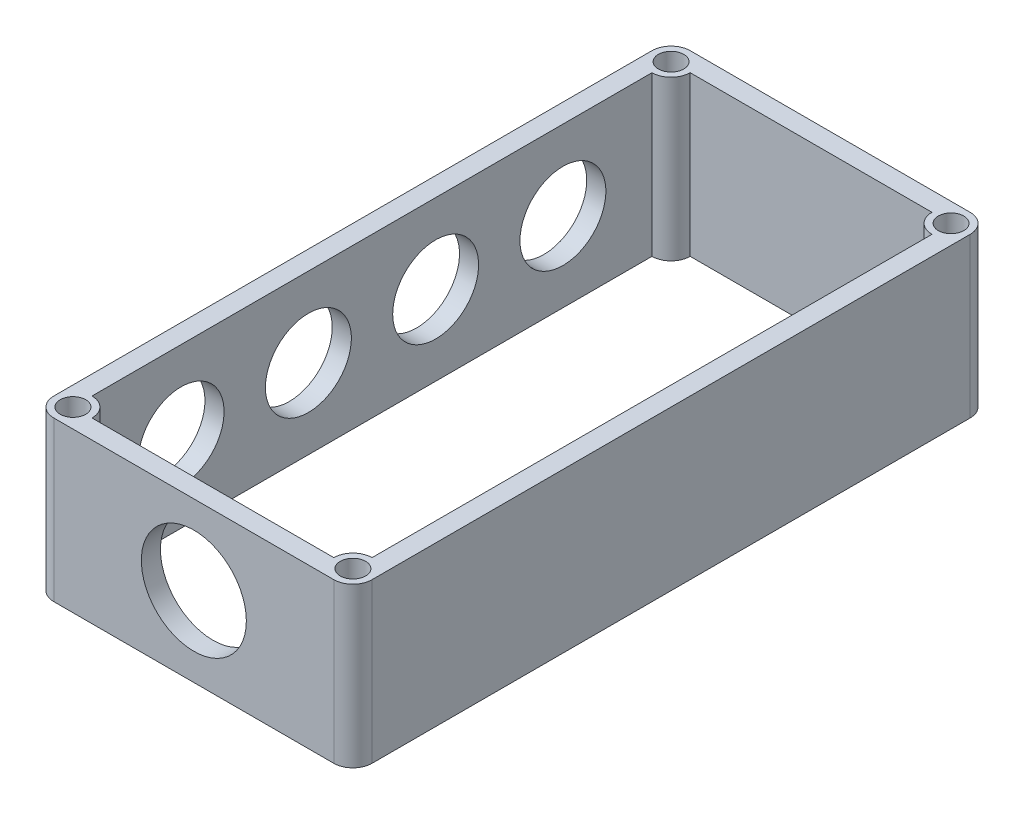
ISO-10303-21;
HEADER;
FILE_DESCRIPTION(('STEP AP214'),'2;1');
FILE_NAME('part.step','',(''),(''),'','','');
FILE_SCHEMA(('AUTOMOTIVE_DESIGN { 1 0 10303 214 1 1 1 1 }'));
ENDSEC;
DATA;
#1=APPLICATION_CONTEXT('core data for automotive mechanical design processes');
#2=APPLICATION_PROTOCOL_DEFINITION('international standard','automotive_design',2000,#1);
#3=PRODUCT_CONTEXT('',#1,'mechanical');
#4=PRODUCT('Part','Part','',(#3));
#5=PRODUCT_RELATED_PRODUCT_CATEGORY('part','',(#4));
#6=PRODUCT_DEFINITION_FORMATION('','',#4);
#7=PRODUCT_DEFINITION_CONTEXT('part definition',#1,'design');
#8=PRODUCT_DEFINITION('design','',#6,#7);
#9=PRODUCT_DEFINITION_SHAPE('','',#8);
#10=(LENGTH_UNIT() NAMED_UNIT(*) SI_UNIT(.MILLI.,.METRE.));
#11=(NAMED_UNIT(*) PLANE_ANGLE_UNIT() SI_UNIT($,.RADIAN.));
#12=(NAMED_UNIT(*) SI_UNIT($,.STERADIAN.) SOLID_ANGLE_UNIT());
#13=UNCERTAINTY_MEASURE_WITH_UNIT(LENGTH_MEASURE(1.E-05),#10,'distance_accuracy_value','');
#14=(GEOMETRIC_REPRESENTATION_CONTEXT(3) GLOBAL_UNCERTAINTY_ASSIGNED_CONTEXT((#13)) GLOBAL_UNIT_ASSIGNED_CONTEXT((#10,
#11,#12)) REPRESENTATION_CONTEXT('',''));
#15=CARTESIAN_POINT('',(0.,0.,0.));
#16=DIRECTION('',(0.,0.,1.));
#17=DIRECTION('',(1.,0.,0.));
#18=AXIS2_PLACEMENT_3D('',#15,#16,#17);
#19=CARTESIAN_POINT('',(22.,25.,0.));
#20=DIRECTION('',(-1.,0.,0.));
#21=DIRECTION('',(0.,0.,1.));
#22=AXIS2_PLACEMENT_3D('',#19,#20,#21);
#23=PLANE('',#22);
#24=DIRECTION('',(0.,0.,-1.));
#25=VECTOR('',#24,1.);
#26=CARTESIAN_POINT('',(22.,0.,0.));
#27=LINE('',#26,#25);
#28=CARTESIAN_POINT('',(22.,0.,44.));
#29=VERTEX_POINT('',#28);
#30=CARTESIAN_POINT('',(22.,0.,-44.));
#31=VERTEX_POINT('',#30);
#32=EDGE_CURVE('E249',#29,#31,#27,.T.);
#33=ORIENTED_EDGE('',*,*,#32,.F.);
#34=DIRECTION('',(0.,-1.,0.));
#35=VECTOR('',#34,1.);
#36=CARTESIAN_POINT('',(22.,25.,44.));
#37=LINE('',#36,#35);
#38=CARTESIAN_POINT('',(22.,25.,44.));
#39=VERTEX_POINT('',#38);
#40=EDGE_CURVE('E11',#39,#29,#37,.T.);
#41=ORIENTED_EDGE('',*,*,#40,.F.);
#42=DIRECTION('',(0.,0.,-1.));
#43=VECTOR('',#42,1.);
#44=CARTESIAN_POINT('',(22.,25.,0.));
#45=LINE('',#44,#43);
#46=CARTESIAN_POINT('',(22.,25.,-44.));
#47=VERTEX_POINT('',#46);
#48=EDGE_CURVE('E293',#39,#47,#45,.T.);
#49=ORIENTED_EDGE('',*,*,#48,.T.);
#50=DIRECTION('',(0.,-1.,0.));
#51=VECTOR('',#50,1.);
#52=CARTESIAN_POINT('',(22.,25.,-44.));
#53=LINE('',#52,#51);
#54=EDGE_CURVE('E118',#47,#31,#53,.T.);
#55=ORIENTED_EDGE('',*,*,#54,.T.);
#56=EDGE_LOOP('',(#33,#41,#49,#55));
#57=FACE_BOUND('',#56,.T.);
#58=ADVANCED_FACE('F41',(#57),#23,.T.);
#59=CARTESIAN_POINT('',(22.,25.,47.));
#60=DIRECTION('',(0.,-1.,0.));
#61=DIRECTION('',(0.,0.,-1.));
#62=AXIS2_PLACEMENT_3D('',#59,#60,#61);
#63=CYLINDRICAL_SURFACE('',#62,3.);
#64=CARTESIAN_POINT('',(22.,0.,47.));
#65=DIRECTION('',(0.,1.,0.));
#66=DIRECTION('',(0.,0.,1.));
#67=AXIS2_PLACEMENT_3D('',#64,#65,#66);
#68=CIRCLE('',#67,3.);
#69=CARTESIAN_POINT('',(19.,0.,47.));
#70=VERTEX_POINT('',#69);
#71=EDGE_CURVE('E246',#29,#70,#68,.T.);
#72=ORIENTED_EDGE('',*,*,#71,.T.);
#73=DIRECTION('',(0.,-1.,0.));
#74=VECTOR('',#73,1.);
#75=CARTESIAN_POINT('',(19.,25.,47.));
#76=LINE('',#75,#74);
#77=CARTESIAN_POINT('',(19.,25.,47.));
#78=VERTEX_POINT('',#77);
#79=EDGE_CURVE('E51',#78,#70,#76,.T.);
#80=ORIENTED_EDGE('',*,*,#79,.F.);
#81=CARTESIAN_POINT('',(22.,25.,47.));
#82=DIRECTION('',(0.,1.,0.));
#83=DIRECTION('',(0.,0.,1.));
#84=AXIS2_PLACEMENT_3D('',#81,#82,#83);
#85=CIRCLE('',#84,3.);
#86=EDGE_CURVE('E291',#39,#78,#85,.T.);
#87=ORIENTED_EDGE('',*,*,#86,.F.);
#88=ORIENTED_EDGE('',*,*,#40,.T.);
#89=EDGE_LOOP('',(#72,#80,#87,#88));
#90=FACE_BOUND('',#89,.T.);
#91=ADVANCED_FACE('F369',(#90),#63,.T.);
#92=CARTESIAN_POINT('',(0.,25.,47.));
#93=DIRECTION('',(0.,0.,-1.));
#94=DIRECTION('',(-1.,0.,0.));
#95=AXIS2_PLACEMENT_3D('',#92,#93,#94);
#96=PLANE('',#95);
#97=CARTESIAN_POINT('',(-3.96810110022986E-12,12.5,47.));
#98=DIRECTION('',(0.,0.,-1.));
#99=DIRECTION('',(-1.,0.,0.));
#100=AXIS2_PLACEMENT_3D('',#97,#98,#99);
#101=CIRCLE('',#100,8.25);
#102=CARTESIAN_POINT('',(-8.25000000000397,12.5,47.));
#103=VERTEX_POINT('',#102);
#104=EDGE_CURVE('E314',#103,#103,#101,.F.);
#105=ORIENTED_EDGE('',*,*,#104,.T.);
#106=EDGE_LOOP('',(#105));
#107=FACE_BOUND('',#106,.T.);
#108=DIRECTION('',(1.,0.,0.));
#109=VECTOR('',#108,1.);
#110=CARTESIAN_POINT('',(0.,0.,47.));
#111=LINE('',#110,#109);
#112=CARTESIAN_POINT('',(-19.,0.,47.));
#113=VERTEX_POINT('',#112);
#114=EDGE_CURVE('E243',#113,#70,#111,.T.);
#115=ORIENTED_EDGE('',*,*,#114,.F.);
#116=DIRECTION('',(0.,-1.,0.));
#117=VECTOR('',#116,1.);
#118=CARTESIAN_POINT('',(-19.,25.,47.));
#119=LINE('',#118,#117);
#120=CARTESIAN_POINT('',(-19.,25.,47.));
#121=VERTEX_POINT('',#120);
#122=EDGE_CURVE('E196',#121,#113,#119,.T.);
#123=ORIENTED_EDGE('',*,*,#122,.F.);
#124=DIRECTION('',(1.,0.,0.));
#125=VECTOR('',#124,1.);
#126=CARTESIAN_POINT('',(0.,25.,47.));
#127=LINE('',#126,#125);
#128=EDGE_CURVE('E288',#121,#78,#127,.T.);
#129=ORIENTED_EDGE('',*,*,#128,.T.);
#130=ORIENTED_EDGE('',*,*,#79,.T.);
#131=EDGE_LOOP('',(#115,#123,#129,#130));
#132=FACE_BOUND('',#131,.T.);
#133=ADVANCED_FACE('F363',(#107,#132),#96,.T.);
#134=CARTESIAN_POINT('',(-22.,25.,47.));
#135=DIRECTION('',(0.,-1.,0.));
#136=DIRECTION('',(0.,0.,-1.));
#137=AXIS2_PLACEMENT_3D('',#134,#135,#136);
#138=CYLINDRICAL_SURFACE('',#137,3.);
#139=CARTESIAN_POINT('',(-22.,0.,47.));
#140=DIRECTION('',(0.,1.,0.));
#141=DIRECTION('',(0.,0.,1.));
#142=AXIS2_PLACEMENT_3D('',#139,#140,#141);
#143=CIRCLE('',#142,3.);
#144=CARTESIAN_POINT('',(-22.,0.,44.));
#145=VERTEX_POINT('',#144);
#146=EDGE_CURVE('E240',#113,#145,#143,.T.);
#147=ORIENTED_EDGE('',*,*,#146,.T.);
#148=DIRECTION('',(0.,-1.,0.));
#149=VECTOR('',#148,1.);
#150=CARTESIAN_POINT('',(-22.,25.,44.));
#151=LINE('',#150,#149);
#152=CARTESIAN_POINT('',(-22.,25.,44.));
#153=VERTEX_POINT('',#152);
#154=EDGE_CURVE('E189',#153,#145,#151,.T.);
#155=ORIENTED_EDGE('',*,*,#154,.F.);
#156=CARTESIAN_POINT('',(-22.,25.,47.));
#157=DIRECTION('',(0.,1.,0.));
#158=DIRECTION('',(0.,0.,1.));
#159=AXIS2_PLACEMENT_3D('',#156,#157,#158);
#160=CIRCLE('',#159,3.);
#161=EDGE_CURVE('E286',#121,#153,#160,.T.);
#162=ORIENTED_EDGE('',*,*,#161,.F.);
#163=ORIENTED_EDGE('',*,*,#122,.T.);
#164=EDGE_LOOP('',(#147,#155,#162,#163));
#165=FACE_BOUND('',#164,.T.);
#166=ADVANCED_FACE('F347',(#165),#138,.T.);
#167=CARTESIAN_POINT('',(-22.,25.,0.));
#168=DIRECTION('',(-1.,0.,0.));
#169=DIRECTION('',(0.,0.,1.));
#170=AXIS2_PLACEMENT_3D('',#167,#168,#169);
#171=PLANE('',#170);
#172=CARTESIAN_POINT('',(-22.,12.5,-30.));
#173=DIRECTION('',(-1.,0.,0.));
#174=DIRECTION('',(0.,0.,1.));
#175=AXIS2_PLACEMENT_3D('',#172,#173,#174);
#176=CIRCLE('',#175,6.75);
#177=CARTESIAN_POINT('',(-22.,12.5,-23.25));
#178=VERTEX_POINT('',#177);
#179=EDGE_CURVE('E317',#178,#178,#176,.F.);
#180=ORIENTED_EDGE('',*,*,#179,.F.);
#181=EDGE_LOOP('',(#180));
#182=FACE_BOUND('',#181,.T.);
#183=CARTESIAN_POINT('',(-22.,12.5,-10.));
#184=DIRECTION('',(-1.,0.,0.));
#185=DIRECTION('',(0.,0.,1.));
#186=AXIS2_PLACEMENT_3D('',#183,#184,#185);
#187=CIRCLE('',#186,6.75);
#188=CARTESIAN_POINT('',(-22.,12.5,-3.25));
#189=VERTEX_POINT('',#188);
#190=EDGE_CURVE('E330',#189,#189,#187,.F.);
#191=ORIENTED_EDGE('',*,*,#190,.F.);
#192=EDGE_LOOP('',(#191));
#193=FACE_BOUND('',#192,.T.);
#194=CARTESIAN_POINT('',(-22.,12.5,10.));
#195=DIRECTION('',(-1.,0.,0.));
#196=DIRECTION('',(0.,0.,1.));
#197=AXIS2_PLACEMENT_3D('',#194,#195,#196);
#198=CIRCLE('',#197,6.75);
#199=CARTESIAN_POINT('',(-22.,12.5,16.75));
#200=VERTEX_POINT('',#199);
#201=EDGE_CURVE('E324',#200,#200,#198,.F.);
#202=ORIENTED_EDGE('',*,*,#201,.F.);
#203=EDGE_LOOP('',(#202));
#204=FACE_BOUND('',#203,.T.);
#205=CARTESIAN_POINT('',(-22.,12.5,30.));
#206=DIRECTION('',(-1.,0.,0.));
#207=DIRECTION('',(0.,0.,1.));
#208=AXIS2_PLACEMENT_3D('',#205,#206,#207);
#209=CIRCLE('',#208,6.75);
#210=CARTESIAN_POINT('',(-22.,12.5,36.75));
#211=VERTEX_POINT('',#210);
#212=EDGE_CURVE('E318',#211,#211,#209,.F.);
#213=ORIENTED_EDGE('',*,*,#212,.F.);
#214=EDGE_LOOP('',(#213));
#215=FACE_BOUND('',#214,.T.);
#216=DIRECTION('',(0.,0.,-1.));
#217=VECTOR('',#216,1.);
#218=CARTESIAN_POINT('',(-22.,0.,0.));
#219=LINE('',#218,#217);
#220=CARTESIAN_POINT('',(-22.,0.,-44.));
#221=VERTEX_POINT('',#220);
#222=EDGE_CURVE('E237',#145,#221,#219,.T.);
#223=ORIENTED_EDGE('',*,*,#222,.T.);
#224=DIRECTION('',(0.,-1.,0.));
#225=VECTOR('',#224,1.);
#226=CARTESIAN_POINT('',(-22.,25.,-44.));
#227=LINE('',#226,#225);
#228=CARTESIAN_POINT('',(-22.,25.,-44.));
#229=VERTEX_POINT('',#228);
#230=EDGE_CURVE('E187',#229,#221,#227,.T.);
#231=ORIENTED_EDGE('',*,*,#230,.F.);
#232=DIRECTION('',(0.,0.,-1.));
#233=VECTOR('',#232,1.);
#234=CARTESIAN_POINT('',(-22.,25.,0.));
#235=LINE('',#234,#233);
#236=EDGE_CURVE('E180',#153,#229,#235,.T.);
#237=ORIENTED_EDGE('',*,*,#236,.F.);
#238=ORIENTED_EDGE('',*,*,#154,.T.);
#239=EDGE_LOOP('',(#223,#231,#237,#238));
#240=FACE_BOUND('',#239,.T.);
#241=ADVANCED_FACE('F344',(#182,#193,#204,#215,#240),#171,.F.);
#242=CARTESIAN_POINT('',(-22.,25.,-47.));
#243=DIRECTION('',(0.,-1.,0.));
#244=DIRECTION('',(0.,0.,-1.));
#245=AXIS2_PLACEMENT_3D('',#242,#243,#244);
#246=CYLINDRICAL_SURFACE('',#245,3.);
#247=CARTESIAN_POINT('',(-22.,0.,-47.));
#248=DIRECTION('',(0.,1.,0.));
#249=DIRECTION('',(0.,0.,1.));
#250=AXIS2_PLACEMENT_3D('',#247,#248,#249);
#251=CIRCLE('',#250,3.);
#252=CARTESIAN_POINT('',(-19.,0.,-47.));
#253=VERTEX_POINT('',#252);
#254=EDGE_CURVE('E186',#221,#253,#251,.T.);
#255=ORIENTED_EDGE('',*,*,#254,.T.);
#256=DIRECTION('',(0.,-1.,0.));
#257=VECTOR('',#256,1.);
#258=CARTESIAN_POINT('',(-19.,25.,-47.));
#259=LINE('',#258,#257);
#260=CARTESIAN_POINT('',(-19.,25.,-47.));
#261=VERTEX_POINT('',#260);
#262=EDGE_CURVE('E171',#261,#253,#259,.T.);
#263=ORIENTED_EDGE('',*,*,#262,.F.);
#264=CARTESIAN_POINT('',(-22.,25.,-47.));
#265=DIRECTION('',(0.,1.,0.));
#266=DIRECTION('',(0.,0.,1.));
#267=AXIS2_PLACEMENT_3D('',#264,#265,#266);
#268=CIRCLE('',#267,3.);
#269=EDGE_CURVE('E174',#229,#261,#268,.T.);
#270=ORIENTED_EDGE('',*,*,#269,.F.);
#271=ORIENTED_EDGE('',*,*,#230,.T.);
#272=EDGE_LOOP('',(#255,#263,#270,#271));
#273=FACE_BOUND('',#272,.T.);
#274=ADVANCED_FACE('F185',(#273),#246,.T.);
#275=CARTESIAN_POINT('',(0.,25.,-47.));
#276=DIRECTION('',(0.,0.,-1.));
#277=DIRECTION('',(-1.,0.,0.));
#278=AXIS2_PLACEMENT_3D('',#275,#276,#277);
#279=PLANE('',#278);
#280=DIRECTION('',(1.,0.,0.));
#281=VECTOR('',#280,1.);
#282=CARTESIAN_POINT('',(0.,0.,-47.));
#283=LINE('',#282,#281);
#284=CARTESIAN_POINT('',(19.,0.,-47.));
#285=VERTEX_POINT('',#284);
#286=EDGE_CURVE('E234',#253,#285,#283,.T.);
#287=ORIENTED_EDGE('',*,*,#286,.T.);
#288=DIRECTION('',(0.,-1.,0.));
#289=VECTOR('',#288,1.);
#290=CARTESIAN_POINT('',(19.,25.,-47.));
#291=LINE('',#290,#289);
#292=CARTESIAN_POINT('',(19.,25.,-47.));
#293=VERTEX_POINT('',#292);
#294=EDGE_CURVE('E173',#293,#285,#291,.T.);
#295=ORIENTED_EDGE('',*,*,#294,.F.);
#296=DIRECTION('',(1.,0.,0.));
#297=VECTOR('',#296,1.);
#298=CARTESIAN_POINT('',(0.,25.,-47.));
#299=LINE('',#298,#297);
#300=EDGE_CURVE('E166',#261,#293,#299,.T.);
#301=ORIENTED_EDGE('',*,*,#300,.F.);
#302=ORIENTED_EDGE('',*,*,#262,.T.);
#303=EDGE_LOOP('',(#287,#295,#301,#302));
#304=FACE_BOUND('',#303,.T.);
#305=ADVANCED_FACE('F169',(#304),#279,.F.);
#306=CARTESIAN_POINT('',(0.,25.,50.));
#307=DIRECTION('',(0.,0.,-1.));
#308=DIRECTION('',(-1.,0.,0.));
#309=AXIS2_PLACEMENT_3D('',#306,#307,#308);
#310=PLANE('',#309);
#311=CARTESIAN_POINT('',(-3.96810110022986E-12,12.5,50.));
#312=DIRECTION('',(0.,0.,1.));
#313=DIRECTION('',(1.,0.,0.));
#314=AXIS2_PLACEMENT_3D('',#311,#312,#313);
#315=CIRCLE('',#314,8.25);
#316=CARTESIAN_POINT('',(8.24999999999603,12.5,50.));
#317=VERTEX_POINT('',#316);
#318=EDGE_CURVE('E272',#317,#317,#315,.T.);
#319=ORIENTED_EDGE('',*,*,#318,.F.);
#320=EDGE_LOOP('',(#319));
#321=FACE_BOUND('',#320,.T.);
#322=DIRECTION('',(1.,0.,0.));
#323=VECTOR('',#322,1.);
#324=CARTESIAN_POINT('',(0.,0.,50.));
#325=LINE('',#324,#323);
#326=CARTESIAN_POINT('',(-22.,0.,50.));
#327=VERTEX_POINT('',#326);
#328=CARTESIAN_POINT('',(22.,0.,50.));
#329=VERTEX_POINT('',#328);
#330=EDGE_CURVE('E270',#327,#329,#325,.T.);
#331=ORIENTED_EDGE('',*,*,#330,.T.);
#332=DIRECTION('',(0.,-1.,0.));
#333=VECTOR('',#332,1.);
#334=CARTESIAN_POINT('',(22.,25.,50.));
#335=LINE('',#334,#333);
#336=CARTESIAN_POINT('',(22.,25.,50.));
#337=VERTEX_POINT('',#336);
#338=EDGE_CURVE('E45',#337,#329,#335,.T.);
#339=ORIENTED_EDGE('',*,*,#338,.F.);
#340=DIRECTION('',(1.,0.,0.));
#341=VECTOR('',#340,1.);
#342=CARTESIAN_POINT('',(0.,25.,50.));
#343=LINE('',#342,#341);
#344=CARTESIAN_POINT('',(-22.,25.,50.));
#345=VERTEX_POINT('',#344);
#346=EDGE_CURVE('E223',#345,#337,#343,.T.);
#347=ORIENTED_EDGE('',*,*,#346,.F.);
#348=DIRECTION('',(0.,-1.,0.));
#349=VECTOR('',#348,1.);
#350=CARTESIAN_POINT('',(-22.,25.,50.));
#351=LINE('',#350,#349);
#352=EDGE_CURVE('E199',#345,#327,#351,.T.);
#353=ORIENTED_EDGE('',*,*,#352,.T.);
#354=EDGE_LOOP('',(#331,#339,#347,#353));
#355=FACE_BOUND('',#354,.T.);
#356=ADVANCED_FACE('F43',(#321,#355),#310,.F.);
#357=CARTESIAN_POINT('',(22.,25.,47.));
#358=DIRECTION('',(0.,-1.,0.));
#359=DIRECTION('',(0.,0.,-1.));
#360=AXIS2_PLACEMENT_3D('',#357,#358,#359);
#361=CYLINDRICAL_SURFACE('',#360,3.00000000000001);
#362=CARTESIAN_POINT('',(22.,0.,47.));
#363=DIRECTION('',(0.,1.,0.));
#364=DIRECTION('',(0.,0.,1.));
#365=AXIS2_PLACEMENT_3D('',#362,#363,#364);
#366=CIRCLE('',#365,3.00000000000001);
#367=CARTESIAN_POINT('',(25.,0.,47.));
#368=VERTEX_POINT('',#367);
#369=EDGE_CURVE('E268',#329,#368,#366,.T.);
#370=ORIENTED_EDGE('',*,*,#369,.T.);
#371=DIRECTION('',(0.,-1.,0.));
#372=VECTOR('',#371,1.);
#373=CARTESIAN_POINT('',(25.,25.,47.));
#374=LINE('',#373,#372);
#375=CARTESIAN_POINT('',(25.,25.,47.));
#376=VERTEX_POINT('',#375);
#377=EDGE_CURVE('E212',#376,#368,#374,.T.);
#378=ORIENTED_EDGE('',*,*,#377,.F.);
#379=CARTESIAN_POINT('',(22.,25.,47.));
#380=DIRECTION('',(0.,1.,0.));
#381=DIRECTION('',(0.,0.,1.));
#382=AXIS2_PLACEMENT_3D('',#379,#380,#381);
#383=CIRCLE('',#382,3.00000000000001);
#384=EDGE_CURVE('E126',#337,#376,#383,.T.);
#385=ORIENTED_EDGE('',*,*,#384,.F.);
#386=ORIENTED_EDGE('',*,*,#338,.T.);
#387=EDGE_LOOP('',(#370,#378,#385,#386));
#388=FACE_BOUND('',#387,.T.);
#389=ADVANCED_FACE('F410',(#388),#361,.T.);
#390=CARTESIAN_POINT('',(25.,25.,0.));
#391=DIRECTION('',(-1.,0.,0.));
#392=DIRECTION('',(0.,0.,1.));
#393=AXIS2_PLACEMENT_3D('',#390,#391,#392);
#394=PLANE('',#393);
#395=DIRECTION('',(0.,0.,-1.));
#396=VECTOR('',#395,1.);
#397=CARTESIAN_POINT('',(25.,0.,0.));
#398=LINE('',#397,#396);
#399=CARTESIAN_POINT('',(25.,0.,-47.));
#400=VERTEX_POINT('',#399);
#401=EDGE_CURVE('E266',#368,#400,#398,.T.);
#402=ORIENTED_EDGE('',*,*,#401,.T.);
#403=DIRECTION('',(0.,-1.,0.));
#404=VECTOR('',#403,1.);
#405=CARTESIAN_POINT('',(25.,25.,-47.));
#406=LINE('',#405,#404);
#407=CARTESIAN_POINT('',(25.,25.,-47.));
#408=VERTEX_POINT('',#407);
#409=EDGE_CURVE('E210',#408,#400,#406,.T.);
#410=ORIENTED_EDGE('',*,*,#409,.F.);
#411=DIRECTION('',(0.,0.,-1.));
#412=VECTOR('',#411,1.);
#413=CARTESIAN_POINT('',(25.,25.,0.));
#414=LINE('',#413,#412);
#415=EDGE_CURVE('E308',#376,#408,#414,.T.);
#416=ORIENTED_EDGE('',*,*,#415,.F.);
#417=ORIENTED_EDGE('',*,*,#377,.T.);
#418=EDGE_LOOP('',(#402,#410,#416,#417));
#419=FACE_BOUND('',#418,.T.);
#420=ADVANCED_FACE('F407',(#419),#394,.F.);
#421=CARTESIAN_POINT('',(22.,25.,-47.));
#422=DIRECTION('',(0.,-1.,0.));
#423=DIRECTION('',(0.,0.,-1.));
#424=AXIS2_PLACEMENT_3D('',#421,#422,#423);
#425=CYLINDRICAL_SURFACE('',#424,3.);
#426=CARTESIAN_POINT('',(22.,0.,-47.));
#427=DIRECTION('',(0.,1.,0.));
#428=DIRECTION('',(0.,0.,1.));
#429=AXIS2_PLACEMENT_3D('',#426,#427,#428);
#430=CIRCLE('',#429,3.);
#431=CARTESIAN_POINT('',(22.,0.,-50.));
#432=VERTEX_POINT('',#431);
#433=EDGE_CURVE('E263',#400,#432,#430,.T.);
#434=ORIENTED_EDGE('',*,*,#433,.T.);
#435=DIRECTION('',(0.,-1.,0.));
#436=VECTOR('',#435,1.);
#437=CARTESIAN_POINT('',(22.,25.,-50.));
#438=LINE('',#437,#436);
#439=CARTESIAN_POINT('',(22.,25.,-50.));
#440=VERTEX_POINT('',#439);
#441=EDGE_CURVE('E208',#440,#432,#438,.T.);
#442=ORIENTED_EDGE('',*,*,#441,.F.);
#443=CARTESIAN_POINT('',(22.,25.,-47.));
#444=DIRECTION('',(0.,1.,0.));
#445=DIRECTION('',(0.,0.,1.));
#446=AXIS2_PLACEMENT_3D('',#443,#444,#445);
#447=CIRCLE('',#446,3.);
#448=EDGE_CURVE('E306',#408,#440,#447,.T.);
#449=ORIENTED_EDGE('',*,*,#448,.F.);
#450=ORIENTED_EDGE('',*,*,#409,.T.);
#451=EDGE_LOOP('',(#434,#442,#449,#450));
#452=FACE_BOUND('',#451,.T.);
#453=ADVANCED_FACE('F403',(#452),#425,.T.);
#454=CARTESIAN_POINT('',(0.,25.,-50.));
#455=DIRECTION('',(0.,0.,-1.));
#456=DIRECTION('',(-1.,0.,0.));
#457=AXIS2_PLACEMENT_3D('',#454,#455,#456);
#458=PLANE('',#457);
#459=DIRECTION('',(1.,0.,0.));
#460=VECTOR('',#459,1.);
#461=CARTESIAN_POINT('',(0.,0.,-50.));
#462=LINE('',#461,#460);
#463=CARTESIAN_POINT('',(-22.,0.,-50.));
#464=VERTEX_POINT('',#463);
#465=EDGE_CURVE('E260',#464,#432,#462,.T.);
#466=ORIENTED_EDGE('',*,*,#465,.F.);
#467=DIRECTION('',(0.,-1.,0.));
#468=VECTOR('',#467,1.);
#469=CARTESIAN_POINT('',(-22.,25.,-50.));
#470=LINE('',#469,#468);
#471=CARTESIAN_POINT('',(-22.,25.,-50.));
#472=VERTEX_POINT('',#471);
#473=EDGE_CURVE('E206',#472,#464,#470,.T.);
#474=ORIENTED_EDGE('',*,*,#473,.F.);
#475=DIRECTION('',(1.,0.,0.));
#476=VECTOR('',#475,1.);
#477=CARTESIAN_POINT('',(0.,25.,-50.));
#478=LINE('',#477,#476);
#479=EDGE_CURVE('E303',#472,#440,#478,.T.);
#480=ORIENTED_EDGE('',*,*,#479,.T.);
#481=ORIENTED_EDGE('',*,*,#441,.T.);
#482=EDGE_LOOP('',(#466,#474,#480,#481));
#483=FACE_BOUND('',#482,.T.);
#484=ADVANCED_FACE('F399',(#483),#458,.T.);
#485=CARTESIAN_POINT('',(-22.,25.,-47.));
#486=DIRECTION('',(0.,-1.,0.));
#487=DIRECTION('',(0.,0.,-1.));
#488=AXIS2_PLACEMENT_3D('',#485,#486,#487);
#489=CYLINDRICAL_SURFACE('',#488,3.);
#490=CARTESIAN_POINT('',(-22.,0.,-47.));
#491=DIRECTION('',(0.,1.,0.));
#492=DIRECTION('',(0.,0.,1.));
#493=AXIS2_PLACEMENT_3D('',#490,#491,#492);
#494=CIRCLE('',#493,3.);
#495=CARTESIAN_POINT('',(-25.,0.,-47.));
#496=VERTEX_POINT('',#495);
#497=EDGE_CURVE('E257',#464,#496,#494,.T.);
#498=ORIENTED_EDGE('',*,*,#497,.T.);
#499=DIRECTION('',(0.,-1.,0.));
#500=VECTOR('',#499,1.);
#501=CARTESIAN_POINT('',(-25.,25.,-47.));
#502=LINE('',#501,#500);
#503=CARTESIAN_POINT('',(-25.,25.,-47.));
#504=VERTEX_POINT('',#503);
#505=EDGE_CURVE('E204',#504,#496,#502,.T.);
#506=ORIENTED_EDGE('',*,*,#505,.F.);
#507=CARTESIAN_POINT('',(-22.,25.,-47.));
#508=DIRECTION('',(0.,1.,0.));
#509=DIRECTION('',(0.,0.,1.));
#510=AXIS2_PLACEMENT_3D('',#507,#508,#509);
#511=CIRCLE('',#510,3.);
#512=EDGE_CURVE('E301',#472,#504,#511,.T.);
#513=ORIENTED_EDGE('',*,*,#512,.F.);
#514=ORIENTED_EDGE('',*,*,#473,.T.);
#515=EDGE_LOOP('',(#498,#506,#513,#514));
#516=FACE_BOUND('',#515,.T.);
#517=ADVANCED_FACE('F395',(#516),#489,.T.);
#518=CARTESIAN_POINT('',(-25.,25.,0.));
#519=DIRECTION('',(-1.,0.,0.));
#520=DIRECTION('',(0.,0.,1.));
#521=AXIS2_PLACEMENT_3D('',#518,#519,#520);
#522=PLANE('',#521);
#523=CARTESIAN_POINT('',(-25.,12.5,-30.));
#524=DIRECTION('',(-1.,0.,0.));
#525=DIRECTION('',(0.,0.,1.));
#526=AXIS2_PLACEMENT_3D('',#523,#524,#525);
#527=CIRCLE('',#526,6.75);
#528=CARTESIAN_POINT('',(-25.,12.5,-23.25));
#529=VERTEX_POINT('',#528);
#530=EDGE_CURVE('E336',#529,#529,#527,.T.);
#531=ORIENTED_EDGE('',*,*,#530,.F.);
#532=EDGE_LOOP('',(#531));
#533=FACE_BOUND('',#532,.T.);
#534=CARTESIAN_POINT('',(-25.,12.5,-10.));
#535=DIRECTION('',(-1.,0.,0.));
#536=DIRECTION('',(0.,0.,1.));
#537=AXIS2_PLACEMENT_3D('',#534,#535,#536);
#538=CIRCLE('',#537,6.75);
#539=CARTESIAN_POINT('',(-25.,12.5,-3.25));
#540=VERTEX_POINT('',#539);
#541=EDGE_CURVE('E333',#540,#540,#538,.T.);
#542=ORIENTED_EDGE('',*,*,#541,.F.);
#543=EDGE_LOOP('',(#542));
#544=FACE_BOUND('',#543,.T.);
#545=CARTESIAN_POINT('',(-25.,12.5,10.));
#546=DIRECTION('',(-1.,0.,0.));
#547=DIRECTION('',(0.,0.,-1.));
#548=AXIS2_PLACEMENT_3D('',#545,#546,#547);
#549=CIRCLE('',#548,6.75);
#550=CARTESIAN_POINT('',(-25.,12.5,3.25));
#551=VERTEX_POINT('',#550);
#552=EDGE_CURVE('E327',#551,#551,#549,.T.);
#553=ORIENTED_EDGE('',*,*,#552,.F.);
#554=EDGE_LOOP('',(#553));
#555=FACE_BOUND('',#554,.T.);
#556=CARTESIAN_POINT('',(-25.,12.5,30.));
#557=DIRECTION('',(-1.,0.,0.));
#558=DIRECTION('',(0.,0.,-1.));
#559=AXIS2_PLACEMENT_3D('',#556,#557,#558);
#560=CIRCLE('',#559,6.75);
#561=CARTESIAN_POINT('',(-25.,12.5,23.25));
#562=VERTEX_POINT('',#561);
#563=EDGE_CURVE('E321',#562,#562,#560,.T.);
#564=ORIENTED_EDGE('',*,*,#563,.F.);
#565=EDGE_LOOP('',(#564));
#566=FACE_BOUND('',#565,.T.);
#567=DIRECTION('',(0.,0.,-1.));
#568=VECTOR('',#567,1.);
#569=CARTESIAN_POINT('',(-25.,0.,0.));
#570=LINE('',#569,#568);
#571=CARTESIAN_POINT('',(-25.,0.,47.));
#572=VERTEX_POINT('',#571);
#573=EDGE_CURVE('E254',#572,#496,#570,.T.);
#574=ORIENTED_EDGE('',*,*,#573,.F.);
#575=DIRECTION('',(0.,-1.,0.));
#576=VECTOR('',#575,1.);
#577=CARTESIAN_POINT('',(-25.,25.,47.));
#578=LINE('',#577,#576);
#579=CARTESIAN_POINT('',(-25.,25.,47.));
#580=VERTEX_POINT('',#579);
#581=EDGE_CURVE('E201',#580,#572,#578,.T.);
#582=ORIENTED_EDGE('',*,*,#581,.F.);
#583=DIRECTION('',(0.,0.,-1.));
#584=VECTOR('',#583,1.);
#585=CARTESIAN_POINT('',(-25.,25.,0.));
#586=LINE('',#585,#584);
#587=EDGE_CURVE('E298',#580,#504,#586,.T.);
#588=ORIENTED_EDGE('',*,*,#587,.T.);
#589=ORIENTED_EDGE('',*,*,#505,.T.);
#590=EDGE_LOOP('',(#574,#582,#588,#589));
#591=FACE_BOUND('',#590,.T.);
#592=ADVANCED_FACE('F391',(#533,#544,#555,#566,#591),#522,.T.);
#593=CARTESIAN_POINT('',(-22.,25.,47.));
#594=DIRECTION('',(0.,-1.,0.));
#595=DIRECTION('',(0.,0.,-1.));
#596=AXIS2_PLACEMENT_3D('',#593,#594,#595);
#597=CYLINDRICAL_SURFACE('',#596,2.00000000000001);
#598=CARTESIAN_POINT('',(-22.,25.,47.));
#599=DIRECTION('',(0.,1.,0.));
#600=DIRECTION('',(0.,0.,1.));
#601=AXIS2_PLACEMENT_3D('',#598,#599,#600);
#602=CIRCLE('',#601,2.00000000000001);
#603=CARTESIAN_POINT('',(-22.,25.,49.));
#604=VERTEX_POINT('',#603);
#605=EDGE_CURVE('E275',#604,#604,#602,.T.);
#606=ORIENTED_EDGE('',*,*,#605,.T.);
#607=EDGE_LOOP('',(#606));
#608=FACE_BOUND('',#607,.T.);
#609=CARTESIAN_POINT('',(-22.,0.,47.));
#610=DIRECTION('',(0.,1.,0.));
#611=DIRECTION('',(0.,0.,1.));
#612=AXIS2_PLACEMENT_3D('',#609,#610,#611);
#613=CIRCLE('',#612,2.00000000000001);
#614=CARTESIAN_POINT('',(-22.,0.,49.));
#615=VERTEX_POINT('',#614);
#616=EDGE_CURVE('E224',#615,#615,#613,.T.);
#617=ORIENTED_EDGE('',*,*,#616,.F.);
#618=EDGE_LOOP('',(#617));
#619=FACE_BOUND('',#618,.T.);
#620=ADVANCED_FACE('F394',(#608,#619),#597,.F.);
#621=CARTESIAN_POINT('',(22.,25.,-47.));
#622=DIRECTION('',(0.,-1.,0.));
#623=DIRECTION('',(0.,0.,-1.));
#624=AXIS2_PLACEMENT_3D('',#621,#622,#623);
#625=CYLINDRICAL_SURFACE('',#624,2.00000000000001);
#626=CARTESIAN_POINT('',(22.,25.,-47.));
#627=DIRECTION('',(0.,1.,0.));
#628=DIRECTION('',(0.,0.,1.));
#629=AXIS2_PLACEMENT_3D('',#626,#627,#628);
#630=CIRCLE('',#629,2.00000000000001);
#631=CARTESIAN_POINT('',(22.,25.,-45.));
#632=VERTEX_POINT('',#631);
#633=EDGE_CURVE('E278',#632,#632,#630,.T.);
#634=ORIENTED_EDGE('',*,*,#633,.T.);
#635=EDGE_LOOP('',(#634));
#636=FACE_BOUND('',#635,.T.);
#637=CARTESIAN_POINT('',(22.,0.,-47.));
#638=DIRECTION('',(0.,1.,0.));
#639=DIRECTION('',(0.,0.,1.));
#640=AXIS2_PLACEMENT_3D('',#637,#638,#639);
#641=CIRCLE('',#640,2.00000000000001);
#642=CARTESIAN_POINT('',(22.,0.,-45.));
#643=VERTEX_POINT('',#642);
#644=EDGE_CURVE('E227',#643,#643,#641,.T.);
#645=ORIENTED_EDGE('',*,*,#644,.F.);
#646=EDGE_LOOP('',(#645));
#647=FACE_BOUND('',#646,.T.);
#648=ADVANCED_FACE('F451',(#636,#647),#625,.F.);
#649=CARTESIAN_POINT('',(22.,25.,47.));
#650=DIRECTION('',(0.,-1.,0.));
#651=DIRECTION('',(0.,0.,-1.));
#652=AXIS2_PLACEMENT_3D('',#649,#650,#651);
#653=CYLINDRICAL_SURFACE('',#652,2.00000000000001);
#654=CARTESIAN_POINT('',(22.,25.,47.));
#655=DIRECTION('',(0.,1.,0.));
#656=DIRECTION('',(0.,0.,1.));
#657=AXIS2_PLACEMENT_3D('',#654,#655,#656);
#658=CIRCLE('',#657,2.00000000000001);
#659=CARTESIAN_POINT('',(22.,25.,49.));
#660=VERTEX_POINT('',#659);
#661=EDGE_CURVE('E281',#660,#660,#658,.T.);
#662=ORIENTED_EDGE('',*,*,#661,.T.);
#663=EDGE_LOOP('',(#662));
#664=FACE_BOUND('',#663,.T.);
#665=CARTESIAN_POINT('',(22.,0.,47.));
#666=DIRECTION('',(0.,1.,0.));
#667=DIRECTION('',(0.,0.,1.));
#668=AXIS2_PLACEMENT_3D('',#665,#666,#667);
#669=CIRCLE('',#668,2.00000000000001);
#670=CARTESIAN_POINT('',(22.,0.,49.));
#671=VERTEX_POINT('',#670);
#672=EDGE_CURVE('E230',#671,#671,#669,.T.);
#673=ORIENTED_EDGE('',*,*,#672,.F.);
#674=EDGE_LOOP('',(#673));
#675=FACE_BOUND('',#674,.T.);
#676=ADVANCED_FACE('F455',(#664,#675),#653,.F.);
#677=CARTESIAN_POINT('',(22.,25.,-47.));
#678=DIRECTION('',(0.,-1.,0.));
#679=DIRECTION('',(0.,0.,-1.));
#680=AXIS2_PLACEMENT_3D('',#677,#678,#679);
#681=CYLINDRICAL_SURFACE('',#680,3.);
#682=CARTESIAN_POINT('',(22.,0.,-47.));
#683=DIRECTION('',(0.,1.,0.));
#684=DIRECTION('',(0.,0.,1.));
#685=AXIS2_PLACEMENT_3D('',#682,#683,#684);
#686=CIRCLE('',#685,3.);
#687=EDGE_CURVE('E111',#285,#31,#686,.T.);
#688=ORIENTED_EDGE('',*,*,#687,.T.);
#689=ORIENTED_EDGE('',*,*,#54,.F.);
#690=CARTESIAN_POINT('',(22.,25.,-47.));
#691=DIRECTION('',(0.,1.,0.));
#692=DIRECTION('',(0.,0.,1.));
#693=AXIS2_PLACEMENT_3D('',#690,#691,#692);
#694=CIRCLE('',#693,3.);
#695=EDGE_CURVE('E60',#293,#47,#694,.T.);
#696=ORIENTED_EDGE('',*,*,#695,.F.);
#697=ORIENTED_EDGE('',*,*,#294,.T.);
#698=EDGE_LOOP('',(#688,#689,#696,#697));
#699=FACE_BOUND('',#698,.T.);
#700=ADVANCED_FACE('F389',(#699),#681,.T.);
#701=CARTESIAN_POINT('',(-22.,25.,47.));
#702=DIRECTION('',(0.,-1.,0.));
#703=DIRECTION('',(0.,0.,-1.));
#704=AXIS2_PLACEMENT_3D('',#701,#702,#703);
#705=CYLINDRICAL_SURFACE('',#704,3.00000000000001);
#706=CARTESIAN_POINT('',(-22.,0.,47.));
#707=DIRECTION('',(0.,1.,0.));
#708=DIRECTION('',(0.,0.,1.));
#709=AXIS2_PLACEMENT_3D('',#706,#707,#708);
#710=CIRCLE('',#709,3.00000000000001);
#711=EDGE_CURVE('E251',#327,#572,#710,.F.);
#712=ORIENTED_EDGE('',*,*,#711,.F.);
#713=ORIENTED_EDGE('',*,*,#352,.F.);
#714=CARTESIAN_POINT('',(-22.,25.,47.));
#715=DIRECTION('',(0.,1.,0.));
#716=DIRECTION('',(0.,0.,1.));
#717=AXIS2_PLACEMENT_3D('',#714,#715,#716);
#718=CIRCLE('',#717,3.00000000000001);
#719=EDGE_CURVE('E295',#345,#580,#718,.F.);
#720=ORIENTED_EDGE('',*,*,#719,.T.);
#721=ORIENTED_EDGE('',*,*,#581,.T.);
#722=EDGE_LOOP('',(#712,#713,#720,#721));
#723=FACE_BOUND('',#722,.T.);
#724=ADVANCED_FACE('F385',(#723),#705,.T.);
#725=CARTESIAN_POINT('',(-22.,25.,-47.));
#726=DIRECTION('',(0.,-1.,0.));
#727=DIRECTION('',(0.,0.,-1.));
#728=AXIS2_PLACEMENT_3D('',#725,#726,#727);
#729=CYLINDRICAL_SURFACE('',#728,2.00000000000001);
#730=CARTESIAN_POINT('',(-22.,25.,-47.));
#731=DIRECTION('',(0.,1.,0.));
#732=DIRECTION('',(0.,0.,1.));
#733=AXIS2_PLACEMENT_3D('',#730,#731,#732);
#734=CIRCLE('',#733,2.00000000000001);
#735=CARTESIAN_POINT('',(-22.,25.,-45.));
#736=VERTEX_POINT('',#735);
#737=EDGE_CURVE('E202',#736,#736,#734,.T.);
#738=ORIENTED_EDGE('',*,*,#737,.T.);
#739=EDGE_LOOP('',(#738));
#740=FACE_BOUND('',#739,.T.);
#741=CARTESIAN_POINT('',(-22.,0.,-47.));
#742=DIRECTION('',(0.,1.,0.));
#743=DIRECTION('',(0.,0.,1.));
#744=AXIS2_PLACEMENT_3D('',#741,#742,#743);
#745=CIRCLE('',#744,2.00000000000001);
#746=CARTESIAN_POINT('',(-22.,0.,-45.));
#747=VERTEX_POINT('',#746);
#748=EDGE_CURVE('E220',#747,#747,#745,.T.);
#749=ORIENTED_EDGE('',*,*,#748,.F.);
#750=EDGE_LOOP('',(#749));
#751=FACE_BOUND('',#750,.T.);
#752=ADVANCED_FACE('F388',(#740,#751),#729,.F.);
#753=CARTESIAN_POINT('',(0.,25.,0.));
#754=DIRECTION('',(0.,1.,0.));
#755=DIRECTION('',(0.,0.,1.));
#756=AXIS2_PLACEMENT_3D('',#753,#754,#755);
#757=PLANE('',#756);
#758=ORIENTED_EDGE('',*,*,#346,.T.);
#759=ORIENTED_EDGE('',*,*,#384,.T.);
#760=ORIENTED_EDGE('',*,*,#415,.T.);
#761=ORIENTED_EDGE('',*,*,#448,.T.);
#762=ORIENTED_EDGE('',*,*,#479,.F.);
#763=ORIENTED_EDGE('',*,*,#512,.T.);
#764=ORIENTED_EDGE('',*,*,#587,.F.);
#765=ORIENTED_EDGE('',*,*,#719,.F.);
#766=EDGE_LOOP('',(#758,#759,#760,#761,#762,#763,#764,#765));
#767=FACE_BOUND('',#766,.T.);
#768=ORIENTED_EDGE('',*,*,#48,.F.);
#769=ORIENTED_EDGE('',*,*,#86,.T.);
#770=ORIENTED_EDGE('',*,*,#128,.F.);
#771=ORIENTED_EDGE('',*,*,#161,.T.);
#772=ORIENTED_EDGE('',*,*,#236,.T.);
#773=ORIENTED_EDGE('',*,*,#269,.T.);
#774=ORIENTED_EDGE('',*,*,#300,.T.);
#775=ORIENTED_EDGE('',*,*,#695,.T.);
#776=EDGE_LOOP('',(#768,#769,#770,#771,#772,#773,#774,#775));
#777=FACE_BOUND('',#776,.T.);
#778=ORIENTED_EDGE('',*,*,#661,.F.);
#779=EDGE_LOOP('',(#778));
#780=FACE_BOUND('',#779,.T.);
#781=ORIENTED_EDGE('',*,*,#633,.F.);
#782=EDGE_LOOP('',(#781));
#783=FACE_BOUND('',#782,.T.);
#784=ORIENTED_EDGE('',*,*,#605,.F.);
#785=EDGE_LOOP('',(#784));
#786=FACE_BOUND('',#785,.T.);
#787=ORIENTED_EDGE('',*,*,#737,.F.);
#788=EDGE_LOOP('',(#787));
#789=FACE_BOUND('',#788,.T.);
#790=ADVANCED_FACE('F177',(#767,#777,#780,#783,#786,#789),#757,.T.);
#791=CARTESIAN_POINT('',(0.,0.,0.));
#792=DIRECTION('',(0.,1.,0.));
#793=DIRECTION('',(0.,0.,1.));
#794=AXIS2_PLACEMENT_3D('',#791,#792,#793);
#795=PLANE('',#794);
#796=ORIENTED_EDGE('',*,*,#330,.F.);
#797=ORIENTED_EDGE('',*,*,#711,.T.);
#798=ORIENTED_EDGE('',*,*,#573,.T.);
#799=ORIENTED_EDGE('',*,*,#497,.F.);
#800=ORIENTED_EDGE('',*,*,#465,.T.);
#801=ORIENTED_EDGE('',*,*,#433,.F.);
#802=ORIENTED_EDGE('',*,*,#401,.F.);
#803=ORIENTED_EDGE('',*,*,#369,.F.);
#804=EDGE_LOOP('',(#796,#797,#798,#799,#800,#801,#802,#803));
#805=FACE_BOUND('',#804,.T.);
#806=ORIENTED_EDGE('',*,*,#32,.T.);
#807=ORIENTED_EDGE('',*,*,#687,.F.);
#808=ORIENTED_EDGE('',*,*,#286,.F.);
#809=ORIENTED_EDGE('',*,*,#254,.F.);
#810=ORIENTED_EDGE('',*,*,#222,.F.);
#811=ORIENTED_EDGE('',*,*,#146,.F.);
#812=ORIENTED_EDGE('',*,*,#114,.T.);
#813=ORIENTED_EDGE('',*,*,#71,.F.);
#814=EDGE_LOOP('',(#806,#807,#808,#809,#810,#811,#812,#813));
#815=FACE_BOUND('',#814,.T.);
#816=ORIENTED_EDGE('',*,*,#672,.T.);
#817=EDGE_LOOP('',(#816));
#818=FACE_BOUND('',#817,.T.);
#819=ORIENTED_EDGE('',*,*,#644,.T.);
#820=EDGE_LOOP('',(#819));
#821=FACE_BOUND('',#820,.T.);
#822=ORIENTED_EDGE('',*,*,#616,.T.);
#823=EDGE_LOOP('',(#822));
#824=FACE_BOUND('',#823,.T.);
#825=ORIENTED_EDGE('',*,*,#748,.T.);
#826=EDGE_LOOP('',(#825));
#827=FACE_BOUND('',#826,.T.);
#828=ADVANCED_FACE('F357',(#805,#815,#818,#821,#824,#827),#795,.F.);
#829=CARTESIAN_POINT('',(-3.96810110022986E-12,12.5,-50.001));
#830=DIRECTION('',(0.,0.,1.));
#831=DIRECTION('',(1.,0.,0.));
#832=AXIS2_PLACEMENT_3D('',#829,#830,#831);
#833=CYLINDRICAL_SURFACE('',#832,8.25);
#834=ORIENTED_EDGE('',*,*,#104,.F.);
#835=EDGE_LOOP('',(#834));
#836=FACE_BOUND('',#835,.T.);
#837=ORIENTED_EDGE('',*,*,#318,.T.);
#838=EDGE_LOOP('',(#837));
#839=FACE_BOUND('',#838,.T.);
#840=ADVANCED_FACE('F442',(#836,#839),#833,.F.);
#841=CARTESIAN_POINT('',(25.001,12.5,30.));
#842=DIRECTION('',(-1.,0.,0.));
#843=DIRECTION('',(0.,0.,1.));
#844=AXIS2_PLACEMENT_3D('',#841,#842,#843);
#845=CYLINDRICAL_SURFACE('',#844,6.75);
#846=ORIENTED_EDGE('',*,*,#563,.T.);
#847=EDGE_LOOP('',(#846));
#848=FACE_BOUND('',#847,.T.);
#849=ORIENTED_EDGE('',*,*,#212,.T.);
#850=EDGE_LOOP('',(#849));
#851=FACE_BOUND('',#850,.T.);
#852=ADVANCED_FACE('F647',(#848,#851),#845,.F.);
#853=CARTESIAN_POINT('',(25.001,12.5,10.));
#854=DIRECTION('',(-1.,0.,0.));
#855=DIRECTION('',(0.,0.,1.));
#856=AXIS2_PLACEMENT_3D('',#853,#854,#855);
#857=CYLINDRICAL_SURFACE('',#856,6.75);
#858=ORIENTED_EDGE('',*,*,#552,.T.);
#859=EDGE_LOOP('',(#858));
#860=FACE_BOUND('',#859,.T.);
#861=ORIENTED_EDGE('',*,*,#201,.T.);
#862=EDGE_LOOP('',(#861));
#863=FACE_BOUND('',#862,.T.);
#864=ADVANCED_FACE('F655',(#860,#863),#857,.F.);
#865=CARTESIAN_POINT('',(25.001,12.5,-10.));
#866=DIRECTION('',(-1.,0.,0.));
#867=DIRECTION('',(0.,0.,1.));
#868=AXIS2_PLACEMENT_3D('',#865,#866,#867);
#869=CYLINDRICAL_SURFACE('',#868,6.75);
#870=ORIENTED_EDGE('',*,*,#541,.T.);
#871=EDGE_LOOP('',(#870));
#872=FACE_BOUND('',#871,.T.);
#873=ORIENTED_EDGE('',*,*,#190,.T.);
#874=EDGE_LOOP('',(#873));
#875=FACE_BOUND('',#874,.T.);
#876=ADVANCED_FACE('F664',(#872,#875),#869,.F.);
#877=CARTESIAN_POINT('',(25.001,12.5,-30.));
#878=DIRECTION('',(-1.,0.,0.));
#879=DIRECTION('',(0.,0.,1.));
#880=AXIS2_PLACEMENT_3D('',#877,#878,#879);
#881=CYLINDRICAL_SURFACE('',#880,6.75);
#882=ORIENTED_EDGE('',*,*,#530,.T.);
#883=EDGE_LOOP('',(#882));
#884=FACE_BOUND('',#883,.T.);
#885=ORIENTED_EDGE('',*,*,#179,.T.);
#886=EDGE_LOOP('',(#885));
#887=FACE_BOUND('',#886,.T.);
#888=ADVANCED_FACE('F342',(#884,#887),#881,.F.);
#889=CLOSED_SHELL('',(#58,#91,#133,#166,#241,#274,#305,#356,#389,#420,#453,#484,#517,#592,#620,
#648,#676,#700,#724,#752,#790,#828,#840,#852,#864,#876,#888));
#890=MANIFOLD_SOLID_BREP('B2',#889);
#891=ADVANCED_BREP_SHAPE_REPRESENTATION('',(#18,#890),#14);
#892=SHAPE_DEFINITION_REPRESENTATION(#9,#891);
ENDSEC;
END-ISO-10303-21;
